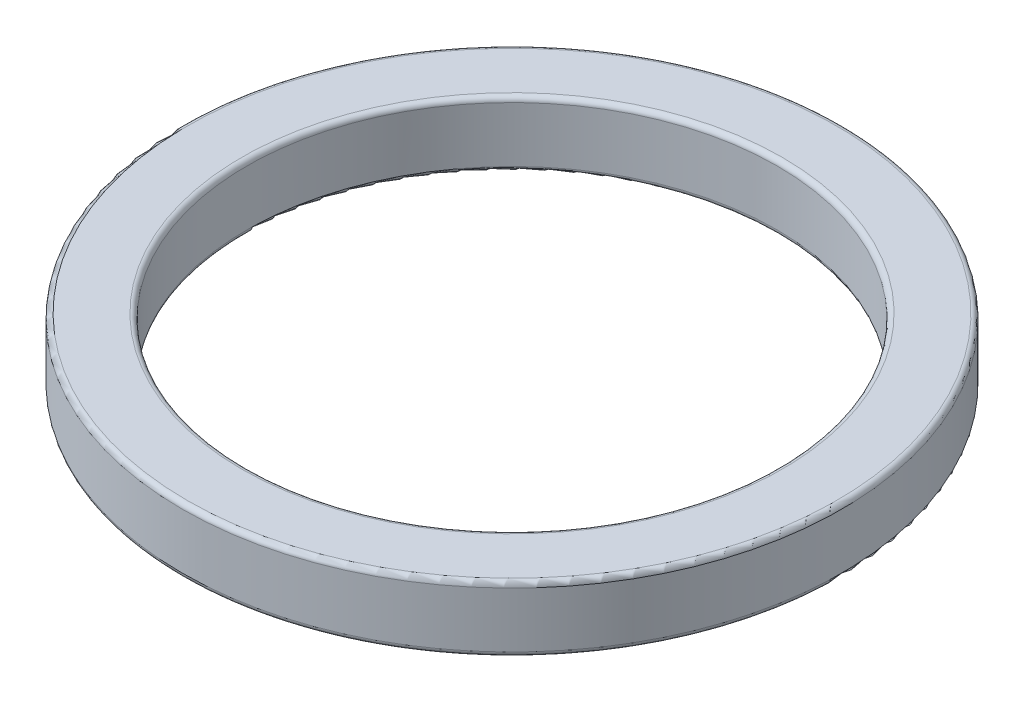
ISO-10303-21;
HEADER;
FILE_DESCRIPTION(('STEP AP214'),'2;1');
FILE_NAME('part.step','',(''),(''),'','','');
FILE_SCHEMA(('AUTOMOTIVE_DESIGN { 1 0 10303 214 1 1 1 1 }'));
ENDSEC;
DATA;
#1=APPLICATION_CONTEXT('core data for automotive mechanical design processes');
#2=APPLICATION_PROTOCOL_DEFINITION('international standard','automotive_design',2000,#1);
#3=PRODUCT_CONTEXT('',#1,'mechanical');
#4=PRODUCT('Part','Part','',(#3));
#5=PRODUCT_RELATED_PRODUCT_CATEGORY('part','',(#4));
#6=PRODUCT_DEFINITION_FORMATION('','',#4);
#7=PRODUCT_DEFINITION_CONTEXT('part definition',#1,'design');
#8=PRODUCT_DEFINITION('design','',#6,#7);
#9=PRODUCT_DEFINITION_SHAPE('','',#8);
#10=(LENGTH_UNIT() NAMED_UNIT(*) SI_UNIT(.MILLI.,.METRE.));
#11=(NAMED_UNIT(*) PLANE_ANGLE_UNIT() SI_UNIT($,.RADIAN.));
#12=(NAMED_UNIT(*) SI_UNIT($,.STERADIAN.) SOLID_ANGLE_UNIT());
#13=UNCERTAINTY_MEASURE_WITH_UNIT(LENGTH_MEASURE(1.E-05),#10,'distance_accuracy_value','');
#14=(GEOMETRIC_REPRESENTATION_CONTEXT(3) GLOBAL_UNCERTAINTY_ASSIGNED_CONTEXT((#13)) GLOBAL_UNIT_ASSIGNED_CONTEXT((#10,
#11,#12)) REPRESENTATION_CONTEXT('',''));
#15=CARTESIAN_POINT('',(0.,0.,0.));
#16=DIRECTION('',(0.,0.,1.));
#17=DIRECTION('',(1.,0.,0.));
#18=AXIS2_PLACEMENT_3D('',#15,#16,#17);
#19=CARTESIAN_POINT('',(0.,0.,0.));
#20=DIRECTION('',(0.,-1.,0.));
#21=DIRECTION('',(0.,0.,-1.));
#22=AXIS2_PLACEMENT_3D('',#19,#20,#21);
#23=CYLINDRICAL_SURFACE('',#22,5.27);
#24=CARTESIAN_POINT('',(0.,1.77172717271727,0.));
#25=DIRECTION('',(0.,-1.,0.));
#26=DIRECTION('',(0.,0.,-1.));
#27=AXIS2_PLACEMENT_3D('',#24,#25,#26);
#28=CIRCLE('',#27,5.27);
#29=CARTESIAN_POINT('',(0.,1.77172717271727,-5.27));
#30=VERTEX_POINT('',#29);
#31=EDGE_CURVE('E58',#30,#30,#28,.T.);
#32=ORIENTED_EDGE('',*,*,#31,.T.);
#33=EDGE_LOOP('',(#32));
#34=FACE_BOUND('',#33,.T.);
#35=CARTESIAN_POINT('',(0.,2.87172717271727,0.));
#36=DIRECTION('',(0.,1.,0.));
#37=DIRECTION('',(0.,0.,1.));
#38=AXIS2_PLACEMENT_3D('',#35,#36,#37);
#39=CIRCLE('',#38,5.27);
#40=CARTESIAN_POINT('',(0.,2.87172717271727,5.27));
#41=VERTEX_POINT('',#40);
#42=EDGE_CURVE('E61',#41,#41,#39,.T.);
#43=ORIENTED_EDGE('',*,*,#42,.T.);
#44=EDGE_LOOP('',(#43));
#45=FACE_BOUND('',#44,.T.);
#46=ADVANCED_FACE('F32',(#34,#45),#23,.F.);
#47=CARTESIAN_POINT('',(5.27,1.67172717271727,0.));
#48=DIRECTION('',(0.,-1.,0.));
#49=DIRECTION('',(0.,0.,-1.));
#50=AXIS2_PLACEMENT_3D('',#47,#48,#49);
#51=PLANE('',#50);
#52=CARTESIAN_POINT('',(0.,1.67172717271727,0.));
#53=DIRECTION('',(0.,-1.,0.));
#54=DIRECTION('',(0.,0.,-1.));
#55=AXIS2_PLACEMENT_3D('',#52,#53,#54);
#56=CIRCLE('',#55,5.37);
#57=CARTESIAN_POINT('',(0.,1.67172717271727,-5.37));
#58=VERTEX_POINT('',#57);
#59=EDGE_CURVE('E52',#58,#58,#56,.F.);
#60=ORIENTED_EDGE('',*,*,#59,.T.);
#61=EDGE_LOOP('',(#60));
#62=FACE_BOUND('',#61,.T.);
#63=CARTESIAN_POINT('',(0.,1.67172717271727,0.));
#64=DIRECTION('',(0.,-1.,0.));
#65=DIRECTION('',(0.,0.,-1.));
#66=AXIS2_PLACEMENT_3D('',#63,#64,#65);
#67=CIRCLE('',#66,6.45);
#68=CARTESIAN_POINT('',(0.,1.67172717271727,-6.45));
#69=VERTEX_POINT('',#68);
#70=EDGE_CURVE('E55',#69,#69,#67,.T.);
#71=ORIENTED_EDGE('',*,*,#70,.T.);
#72=EDGE_LOOP('',(#71));
#73=FACE_BOUND('',#72,.T.);
#74=ADVANCED_FACE('F75',(#62,#73),#51,.T.);
#75=CARTESIAN_POINT('',(0.,0.,0.));
#76=DIRECTION('',(0.,-1.,0.));
#77=DIRECTION('',(0.,0.,-1.));
#78=AXIS2_PLACEMENT_3D('',#75,#76,#77);
#79=CYLINDRICAL_SURFACE('',#78,6.55);
#80=CARTESIAN_POINT('',(0.,1.77172717271727,0.));
#81=DIRECTION('',(0.,-1.,0.));
#82=DIRECTION('',(0.,0.,-1.));
#83=AXIS2_PLACEMENT_3D('',#80,#81,#82);
#84=CIRCLE('',#83,6.55);
#85=CARTESIAN_POINT('',(0.,1.77172717271727,-6.55));
#86=VERTEX_POINT('',#85);
#87=EDGE_CURVE('E43',#86,#86,#84,.F.);
#88=ORIENTED_EDGE('',*,*,#87,.T.);
#89=EDGE_LOOP('',(#88));
#90=FACE_BOUND('',#89,.T.);
#91=CARTESIAN_POINT('',(0.,2.87172717271727,0.));
#92=DIRECTION('',(0.,1.,0.));
#93=DIRECTION('',(0.,0.,1.));
#94=AXIS2_PLACEMENT_3D('',#91,#92,#93);
#95=CIRCLE('',#94,6.55);
#96=CARTESIAN_POINT('',(0.,2.87172717271727,6.55));
#97=VERTEX_POINT('',#96);
#98=EDGE_CURVE('E47',#97,#97,#95,.F.);
#99=ORIENTED_EDGE('',*,*,#98,.T.);
#100=EDGE_LOOP('',(#99));
#101=FACE_BOUND('',#100,.T.);
#102=ADVANCED_FACE('F81',(#90,#101),#79,.T.);
#103=CARTESIAN_POINT('',(5.27,2.97172717271727,0.));
#104=DIRECTION('',(0.,1.,0.));
#105=DIRECTION('',(0.,0.,1.));
#106=AXIS2_PLACEMENT_3D('',#103,#104,#105);
#107=PLANE('',#106);
#108=CARTESIAN_POINT('',(0.,2.97172717271727,0.));
#109=DIRECTION('',(0.,1.,0.));
#110=DIRECTION('',(0.,0.,1.));
#111=AXIS2_PLACEMENT_3D('',#108,#109,#110);
#112=CIRCLE('',#111,6.45);
#113=CARTESIAN_POINT('',(0.,2.97172717271727,6.45));
#114=VERTEX_POINT('',#113);
#115=EDGE_CURVE('E10',#114,#114,#112,.T.);
#116=ORIENTED_EDGE('',*,*,#115,.T.);
#117=EDGE_LOOP('',(#116));
#118=FACE_BOUND('',#117,.T.);
#119=CARTESIAN_POINT('',(0.,2.97172717271727,0.));
#120=DIRECTION('',(0.,1.,0.));
#121=DIRECTION('',(0.,0.,1.));
#122=AXIS2_PLACEMENT_3D('',#119,#120,#121);
#123=CIRCLE('',#122,5.37);
#124=CARTESIAN_POINT('',(0.,2.97172717271727,5.37));
#125=VERTEX_POINT('',#124);
#126=EDGE_CURVE('E39',#125,#125,#123,.F.);
#127=ORIENTED_EDGE('',*,*,#126,.T.);
#128=EDGE_LOOP('',(#127));
#129=FACE_BOUND('',#128,.T.);
#130=ADVANCED_FACE('F89',(#118,#129),#107,.T.);
#131=CARTESIAN_POINT('',(0.,1.77172717271727,0.));
#132=DIRECTION('',(0.,-1.,0.));
#133=DIRECTION('',(0.,0.,-1.));
#134=AXIS2_PLACEMENT_3D('',#131,#132,#133);
#135=TOROIDAL_SURFACE('',#134,5.37,0.1);
#136=ORIENTED_EDGE('',*,*,#59,.F.);
#137=EDGE_LOOP('',(#136));
#138=FACE_BOUND('',#137,.T.);
#139=ORIENTED_EDGE('',*,*,#31,.F.);
#140=EDGE_LOOP('',(#139));
#141=FACE_BOUND('',#140,.T.);
#142=ADVANCED_FACE('F86',(#138,#141),#135,.T.);
#143=CARTESIAN_POINT('',(0.,1.77172717271727,0.));
#144=DIRECTION('',(0.,-1.,0.));
#145=DIRECTION('',(0.,0.,-1.));
#146=AXIS2_PLACEMENT_3D('',#143,#144,#145);
#147=TOROIDAL_SURFACE('',#146,6.45,0.1);
#148=ORIENTED_EDGE('',*,*,#87,.F.);
#149=EDGE_LOOP('',(#148));
#150=FACE_BOUND('',#149,.T.);
#151=ORIENTED_EDGE('',*,*,#70,.F.);
#152=EDGE_LOOP('',(#151));
#153=FACE_BOUND('',#152,.T.);
#154=ADVANCED_FACE('F72',(#150,#153),#147,.T.);
#155=CARTESIAN_POINT('',(0.,2.87172717271727,0.));
#156=DIRECTION('',(0.,1.,0.));
#157=DIRECTION('',(0.,0.,1.));
#158=AXIS2_PLACEMENT_3D('',#155,#156,#157);
#159=TOROIDAL_SURFACE('',#158,6.45,0.1);
#160=ORIENTED_EDGE('',*,*,#115,.F.);
#161=EDGE_LOOP('',(#160));
#162=FACE_BOUND('',#161,.T.);
#163=ORIENTED_EDGE('',*,*,#98,.F.);
#164=EDGE_LOOP('',(#163));
#165=FACE_BOUND('',#164,.T.);
#166=ADVANCED_FACE('F68',(#162,#165),#159,.T.);
#167=CARTESIAN_POINT('',(0.,2.87172717271727,0.));
#168=DIRECTION('',(0.,1.,0.));
#169=DIRECTION('',(0.,0.,1.));
#170=AXIS2_PLACEMENT_3D('',#167,#168,#169);
#171=TOROIDAL_SURFACE('',#170,5.37,0.1);
#172=ORIENTED_EDGE('',*,*,#42,.F.);
#173=EDGE_LOOP('',(#172));
#174=FACE_BOUND('',#173,.T.);
#175=ORIENTED_EDGE('',*,*,#126,.F.);
#176=EDGE_LOOP('',(#175));
#177=FACE_BOUND('',#176,.T.);
#178=ADVANCED_FACE('F34',(#174,#177),#171,.T.);
#179=CLOSED_SHELL('',(#46,#74,#102,#130,#142,#154,#166,#178));
#180=MANIFOLD_SOLID_BREP('B2',#179);
#181=ADVANCED_BREP_SHAPE_REPRESENTATION('',(#18,#180),#14);
#182=SHAPE_DEFINITION_REPRESENTATION(#9,#181);
ENDSEC;
END-ISO-10303-21;
